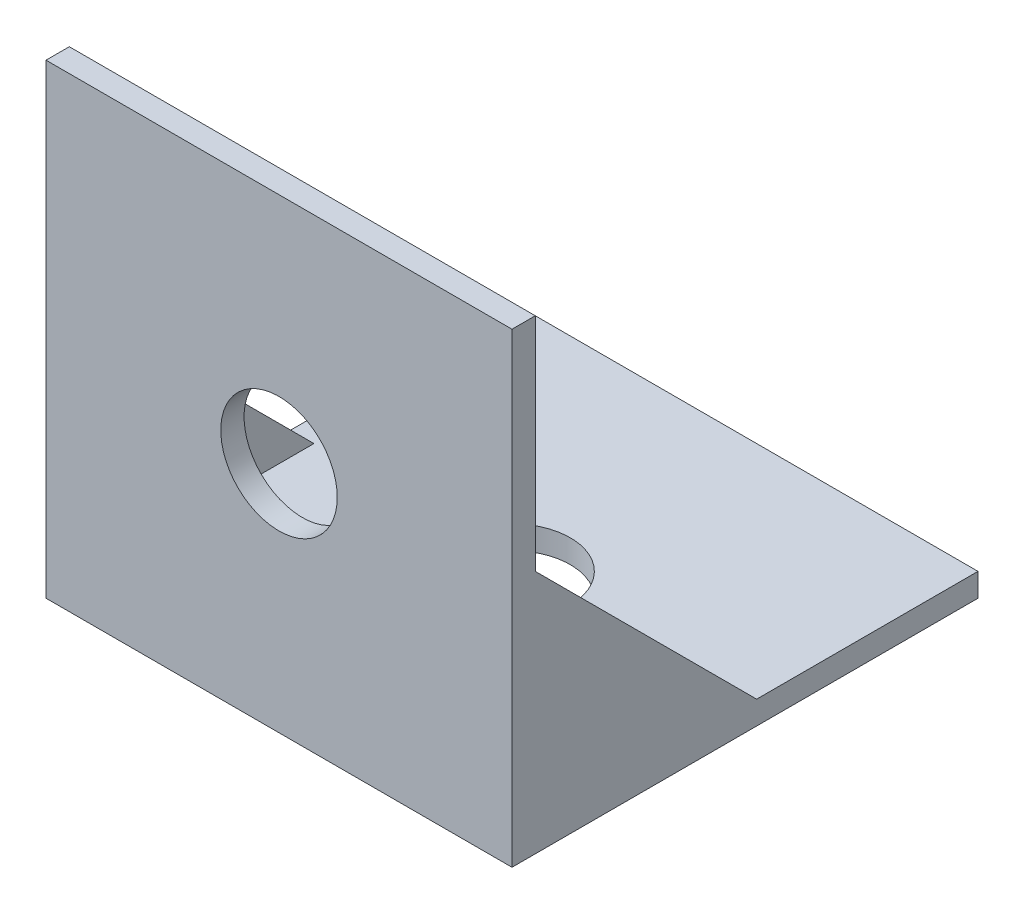
ISO-10303-21;
HEADER;
FILE_DESCRIPTION(('STEP AP214'),'2;1');
FILE_NAME('part.step','',(''),(''),'','','');
FILE_SCHEMA(('AUTOMOTIVE_DESIGN { 1 0 10303 214 1 1 1 1 }'));
ENDSEC;
DATA;
#1=APPLICATION_CONTEXT('core data for automotive mechanical design processes');
#2=APPLICATION_PROTOCOL_DEFINITION('international standard','automotive_design',2000,#1);
#3=PRODUCT_CONTEXT('',#1,'mechanical');
#4=PRODUCT('Part','Part','',(#3));
#5=PRODUCT_RELATED_PRODUCT_CATEGORY('part','',(#4));
#6=PRODUCT_DEFINITION_FORMATION('','',#4);
#7=PRODUCT_DEFINITION_CONTEXT('part definition',#1,'design');
#8=PRODUCT_DEFINITION('design','',#6,#7);
#9=PRODUCT_DEFINITION_SHAPE('','',#8);
#10=(LENGTH_UNIT() NAMED_UNIT(*) SI_UNIT(.MILLI.,.METRE.));
#11=(NAMED_UNIT(*) PLANE_ANGLE_UNIT() SI_UNIT($,.RADIAN.));
#12=(NAMED_UNIT(*) SI_UNIT($,.STERADIAN.) SOLID_ANGLE_UNIT());
#13=UNCERTAINTY_MEASURE_WITH_UNIT(LENGTH_MEASURE(1.E-05),#10,'distance_accuracy_value','');
#14=(GEOMETRIC_REPRESENTATION_CONTEXT(3) GLOBAL_UNCERTAINTY_ASSIGNED_CONTEXT((#13)) GLOBAL_UNIT_ASSIGNED_CONTEXT((#10,
#11,#12)) REPRESENTATION_CONTEXT('',''));
#15=CARTESIAN_POINT('',(0.,0.,0.));
#16=DIRECTION('',(0.,0.,1.));
#17=DIRECTION('',(1.,0.,0.));
#18=AXIS2_PLACEMENT_3D('',#15,#16,#17);
#19=CARTESIAN_POINT('',(0.,1.,0.));
#20=DIRECTION('',(0.,-1.,0.));
#21=DIRECTION('',(0.,0.,-1.));
#22=AXIS2_PLACEMENT_3D('',#19,#20,#21);
#23=PLANE('',#22);
#24=DIRECTION('',(0.,0.,1.));
#25=VECTOR('',#24,1.);
#26=CARTESIAN_POINT('',(-10.,1.,-10.));
#27=LINE('',#26,#25);
#28=CARTESIAN_POINT('',(-10.,1.,-10.));
#29=VERTEX_POINT('',#28);
#30=CARTESIAN_POINT('',(-10.,1.,-0.499999999999999));
#31=VERTEX_POINT('',#30);
#32=EDGE_CURVE('E53',#29,#31,#27,.T.);
#33=ORIENTED_EDGE('',*,*,#32,.T.);
#34=DIRECTION('',(1.,0.,0.));
#35=VECTOR('',#34,1.);
#36=CARTESIAN_POINT('',(-9.99999999999999,1.,-0.499999999999998));
#37=LINE('',#36,#35);
#38=CARTESIAN_POINT('',(-9.,1.,-0.499999999999998));
#39=VERTEX_POINT('',#38);
#40=EDGE_CURVE('E48',#31,#39,#37,.T.);
#41=ORIENTED_EDGE('',*,*,#40,.T.);
#42=DIRECTION('',(0.,0.,-1.));
#43=VECTOR('',#42,1.);
#44=CARTESIAN_POINT('',(-9.,1.,-0.499999999999998));
#45=LINE('',#44,#43);
#46=CARTESIAN_POINT('',(-9.,1.,9.));
#47=VERTEX_POINT('',#46);
#48=EDGE_CURVE('E121',#47,#39,#45,.T.);
#49=ORIENTED_EDGE('',*,*,#48,.F.);
#50=DIRECTION('',(1.,0.,0.));
#51=VECTOR('',#50,1.);
#52=CARTESIAN_POINT('',(0.,1.,9.));
#53=LINE('',#52,#51);
#54=CARTESIAN_POINT('',(9.00000000000001,1.,9.));
#55=VERTEX_POINT('',#54);
#56=EDGE_CURVE('E108',#47,#55,#53,.T.);
#57=ORIENTED_EDGE('',*,*,#56,.T.);
#58=DIRECTION('',(0.,0.,-1.));
#59=VECTOR('',#58,1.);
#60=CARTESIAN_POINT('',(9.00000000000001,1.,-0.499999999999999));
#61=LINE('',#60,#59);
#62=CARTESIAN_POINT('',(9.00000000000001,1.,-0.499999999999999));
#63=VERTEX_POINT('',#62);
#64=EDGE_CURVE('E139',#55,#63,#61,.T.);
#65=ORIENTED_EDGE('',*,*,#64,.T.);
#66=DIRECTION('',(1.,0.,0.));
#67=VECTOR('',#66,1.);
#68=CARTESIAN_POINT('',(9.00000000000001,1.,-0.499999999999999));
#69=LINE('',#68,#67);
#70=CARTESIAN_POINT('',(10.,1.,-0.5));
#71=VERTEX_POINT('',#70);
#72=EDGE_CURVE('E144',#63,#71,#69,.T.);
#73=ORIENTED_EDGE('',*,*,#72,.T.);
#74=DIRECTION('',(0.,0.,-1.));
#75=VECTOR('',#74,1.);
#76=CARTESIAN_POINT('',(10.,1.,-10.));
#77=LINE('',#76,#75);
#78=CARTESIAN_POINT('',(10.,1.,-10.));
#79=VERTEX_POINT('',#78);
#80=EDGE_CURVE('E180',#71,#79,#77,.T.);
#81=ORIENTED_EDGE('',*,*,#80,.T.);
#82=DIRECTION('',(-1.,0.,0.));
#83=VECTOR('',#82,1.);
#84=CARTESIAN_POINT('',(10.,1.,-10.));
#85=LINE('',#84,#83);
#86=EDGE_CURVE('E183',#79,#29,#85,.T.);
#87=ORIENTED_EDGE('',*,*,#86,.T.);
#88=EDGE_LOOP('',(#33,#41,#49,#57,#65,#73,#81,#87));
#89=FACE_BOUND('',#88,.T.);
#90=CARTESIAN_POINT('',(0.,1.,0.));
#91=DIRECTION('',(0.,1.,0.));
#92=DIRECTION('',(0.,0.,1.));
#93=AXIS2_PLACEMENT_3D('',#90,#91,#92);
#94=CIRCLE('',#93,2.5);
#95=CARTESIAN_POINT('',(0.,1.,2.5));
#96=VERTEX_POINT('',#95);
#97=EDGE_CURVE('E173',#96,#96,#94,.T.);
#98=ORIENTED_EDGE('',*,*,#97,.F.);
#99=EDGE_LOOP('',(#98));
#100=FACE_BOUND('',#99,.T.);
#101=ADVANCED_FACE('F33',(#89,#100),#23,.F.);
#102=CARTESIAN_POINT('',(0.,0.,0.));
#103=DIRECTION('',(0.,-1.,0.));
#104=DIRECTION('',(0.,0.,-1.));
#105=AXIS2_PLACEMENT_3D('',#102,#103,#104);
#106=PLANE('',#105);
#107=DIRECTION('',(-1.,0.,0.));
#108=VECTOR('',#107,1.);
#109=CARTESIAN_POINT('',(10.,0.,-10.));
#110=LINE('',#109,#108);
#111=CARTESIAN_POINT('',(10.,0.,-10.));
#112=VERTEX_POINT('',#111);
#113=CARTESIAN_POINT('',(-10.,0.,-10.));
#114=VERTEX_POINT('',#113);
#115=EDGE_CURVE('E181',#112,#114,#110,.T.);
#116=ORIENTED_EDGE('',*,*,#115,.F.);
#117=DIRECTION('',(0.,0.,-1.));
#118=VECTOR('',#117,1.);
#119=CARTESIAN_POINT('',(10.,0.,-10.));
#120=LINE('',#119,#118);
#121=CARTESIAN_POINT('',(10.,0.,10.));
#122=VERTEX_POINT('',#121);
#123=EDGE_CURVE('E189',#122,#112,#120,.T.);
#124=ORIENTED_EDGE('',*,*,#123,.F.);
#125=DIRECTION('',(1.,0.,0.));
#126=VECTOR('',#125,1.);
#127=CARTESIAN_POINT('',(10.,0.,10.));
#128=LINE('',#127,#126);
#129=CARTESIAN_POINT('',(-9.99999999999999,0.,10.));
#130=VERTEX_POINT('',#129);
#131=EDGE_CURVE('E187',#130,#122,#128,.T.);
#132=ORIENTED_EDGE('',*,*,#131,.F.);
#133=DIRECTION('',(0.,0.,1.));
#134=VECTOR('',#133,1.);
#135=CARTESIAN_POINT('',(-10.,0.,-10.));
#136=LINE('',#135,#134);
#137=EDGE_CURVE('E176',#114,#130,#136,.T.);
#138=ORIENTED_EDGE('',*,*,#137,.F.);
#139=EDGE_LOOP('',(#116,#124,#132,#138));
#140=FACE_BOUND('',#139,.T.);
#141=CARTESIAN_POINT('',(0.,0.,0.));
#142=DIRECTION('',(0.,1.,0.));
#143=DIRECTION('',(0.,0.,1.));
#144=AXIS2_PLACEMENT_3D('',#141,#142,#143);
#145=CIRCLE('',#144,2.5);
#146=CARTESIAN_POINT('',(0.,0.,2.5));
#147=VERTEX_POINT('',#146);
#148=EDGE_CURVE('E118',#147,#147,#145,.T.);
#149=ORIENTED_EDGE('',*,*,#148,.T.);
#150=EDGE_LOOP('',(#149));
#151=FACE_BOUND('',#150,.T.);
#152=ADVANCED_FACE('F208',(#140,#151),#106,.T.);
#153=CARTESIAN_POINT('',(-10.,1.,-10.));
#154=DIRECTION('',(1.,0.,0.));
#155=DIRECTION('',(0.,0.,-1.));
#156=AXIS2_PLACEMENT_3D('',#153,#154,#155);
#157=PLANE('',#156);
#158=DIRECTION('',(0.,0.707106781186547,0.707106781186548));
#159=VECTOR('',#158,1.);
#160=CARTESIAN_POINT('',(-9.99999999999999,10.5,9.));
#161=LINE('',#160,#159);
#162=CARTESIAN_POINT('',(-9.99999999999999,10.5,9.));
#163=VERTEX_POINT('',#162);
#164=EDGE_CURVE('E131',#31,#163,#161,.T.);
#165=ORIENTED_EDGE('',*,*,#164,.F.);
#166=ORIENTED_EDGE('',*,*,#32,.F.);
#167=DIRECTION('',(0.,-1.,0.));
#168=VECTOR('',#167,1.);
#169=CARTESIAN_POINT('',(-10.,1.,-10.));
#170=LINE('',#169,#168);
#171=EDGE_CURVE('E185',#29,#114,#170,.T.);
#172=ORIENTED_EDGE('',*,*,#171,.T.);
#173=ORIENTED_EDGE('',*,*,#137,.T.);
#174=DIRECTION('',(0.,-1.,0.));
#175=VECTOR('',#174,1.);
#176=CARTESIAN_POINT('',(-9.99999999999999,1.,10.));
#177=LINE('',#176,#175);
#178=CARTESIAN_POINT('',(-9.99999999999999,20.,10.));
#179=VERTEX_POINT('',#178);
#180=EDGE_CURVE('E11',#179,#130,#177,.T.);
#181=ORIENTED_EDGE('',*,*,#180,.F.);
#182=DIRECTION('',(0.,0.,1.));
#183=VECTOR('',#182,1.);
#184=CARTESIAN_POINT('',(-9.99999999999999,20.,9.));
#185=LINE('',#184,#183);
#186=CARTESIAN_POINT('',(-9.99999999999999,20.,9.));
#187=VERTEX_POINT('',#186);
#188=EDGE_CURVE('E119',#187,#179,#185,.T.);
#189=ORIENTED_EDGE('',*,*,#188,.F.);
#190=DIRECTION('',(0.,-1.,0.));
#191=VECTOR('',#190,1.);
#192=CARTESIAN_POINT('',(-9.99999999999999,0.,9.));
#193=LINE('',#192,#191);
#194=EDGE_CURVE('E158',#187,#163,#193,.T.);
#195=ORIENTED_EDGE('',*,*,#194,.T.);
#196=EDGE_LOOP('',(#165,#166,#172,#173,#181,#189,#195));
#197=FACE_BOUND('',#196,.T.);
#198=ADVANCED_FACE('F35',(#197),#157,.F.);
#199=CARTESIAN_POINT('',(10.,1.,10.));
#200=DIRECTION('',(0.,0.,-1.));
#201=DIRECTION('',(-1.,0.,0.));
#202=AXIS2_PLACEMENT_3D('',#199,#200,#201);
#203=PLANE('',#202);
#204=ORIENTED_EDGE('',*,*,#131,.T.);
#205=DIRECTION('',(0.,-1.,0.));
#206=VECTOR('',#205,1.);
#207=CARTESIAN_POINT('',(10.,1.,10.));
#208=LINE('',#207,#206);
#209=CARTESIAN_POINT('',(10.,20.,10.));
#210=VERTEX_POINT('',#209);
#211=EDGE_CURVE('E41',#210,#122,#208,.T.);
#212=ORIENTED_EDGE('',*,*,#211,.F.);
#213=DIRECTION('',(-1.,0.,0.));
#214=VECTOR('',#213,1.);
#215=CARTESIAN_POINT('',(-9.99999999999999,20.,10.));
#216=LINE('',#215,#214);
#217=EDGE_CURVE('E155',#210,#179,#216,.T.);
#218=ORIENTED_EDGE('',*,*,#217,.T.);
#219=ORIENTED_EDGE('',*,*,#180,.T.);
#220=EDGE_LOOP('',(#204,#212,#218,#219));
#221=FACE_BOUND('',#220,.T.);
#222=CARTESIAN_POINT('',(0.,10.,10.));
#223=DIRECTION('',(0.,0.,1.));
#224=DIRECTION('',(1.,0.,0.));
#225=AXIS2_PLACEMENT_3D('',#222,#223,#224);
#226=CIRCLE('',#225,2.5);
#227=CARTESIAN_POINT('',(2.5,10.,10.));
#228=VERTEX_POINT('',#227);
#229=EDGE_CURVE('E149',#228,#228,#226,.T.);
#230=ORIENTED_EDGE('',*,*,#229,.F.);
#231=EDGE_LOOP('',(#230));
#232=FACE_BOUND('',#231,.T.);
#233=ADVANCED_FACE('F225',(#221,#232),#203,.F.);
#234=CARTESIAN_POINT('',(10.,1.,-10.));
#235=DIRECTION('',(-1.,0.,0.));
#236=DIRECTION('',(0.,0.,1.));
#237=AXIS2_PLACEMENT_3D('',#234,#235,#236);
#238=PLANE('',#237);
#239=ORIENTED_EDGE('',*,*,#80,.F.);
#240=DIRECTION('',(0.,0.707106781186547,0.707106781186548));
#241=VECTOR('',#240,1.);
#242=CARTESIAN_POINT('',(10.,10.5,9.));
#243=LINE('',#242,#241);
#244=CARTESIAN_POINT('',(10.,10.5,9.));
#245=VERTEX_POINT('',#244);
#246=EDGE_CURVE('E136',#71,#245,#243,.T.);
#247=ORIENTED_EDGE('',*,*,#246,.T.);
#248=DIRECTION('',(0.,1.,0.));
#249=VECTOR('',#248,1.);
#250=CARTESIAN_POINT('',(10.,0.,9.));
#251=LINE('',#250,#249);
#252=CARTESIAN_POINT('',(10.,20.,9.));
#253=VERTEX_POINT('',#252);
#254=EDGE_CURVE('E161',#245,#253,#251,.T.);
#255=ORIENTED_EDGE('',*,*,#254,.T.);
#256=DIRECTION('',(0.,0.,1.));
#257=VECTOR('',#256,1.);
#258=CARTESIAN_POINT('',(10.,20.,9.));
#259=LINE('',#258,#257);
#260=EDGE_CURVE('E166',#253,#210,#259,.T.);
#261=ORIENTED_EDGE('',*,*,#260,.T.);
#262=ORIENTED_EDGE('',*,*,#211,.T.);
#263=ORIENTED_EDGE('',*,*,#123,.T.);
#264=DIRECTION('',(0.,-1.,0.));
#265=VECTOR('',#264,1.);
#266=CARTESIAN_POINT('',(10.,1.,-10.));
#267=LINE('',#266,#265);
#268=EDGE_CURVE('E194',#79,#112,#267,.T.);
#269=ORIENTED_EDGE('',*,*,#268,.F.);
#270=EDGE_LOOP('',(#239,#247,#255,#261,#262,#263,#269));
#271=FACE_BOUND('',#270,.T.);
#272=ADVANCED_FACE('F200',(#271),#238,.F.);
#273=CARTESIAN_POINT('',(10.,1.,-10.));
#274=DIRECTION('',(0.,0.,1.));
#275=DIRECTION('',(1.,0.,0.));
#276=AXIS2_PLACEMENT_3D('',#273,#274,#275);
#277=PLANE('',#276);
#278=ORIENTED_EDGE('',*,*,#115,.T.);
#279=ORIENTED_EDGE('',*,*,#171,.F.);
#280=ORIENTED_EDGE('',*,*,#86,.F.);
#281=ORIENTED_EDGE('',*,*,#268,.T.);
#282=EDGE_LOOP('',(#278,#279,#280,#281));
#283=FACE_BOUND('',#282,.T.);
#284=ADVANCED_FACE('F213',(#283),#277,.F.);
#285=CARTESIAN_POINT('',(0.,1.,0.));
#286=DIRECTION('',(0.,-1.,0.));
#287=DIRECTION('',(0.,0.,-1.));
#288=AXIS2_PLACEMENT_3D('',#285,#286,#287);
#289=CYLINDRICAL_SURFACE('',#288,2.5);
#290=ORIENTED_EDGE('',*,*,#97,.T.);
#291=EDGE_LOOP('',(#290));
#292=FACE_BOUND('',#291,.T.);
#293=ORIENTED_EDGE('',*,*,#148,.F.);
#294=EDGE_LOOP('',(#293));
#295=FACE_BOUND('',#294,.T.);
#296=ADVANCED_FACE('F252',(#292,#295),#289,.F.);
#297=CARTESIAN_POINT('',(0.,0.,9.));
#298=DIRECTION('',(0.,0.,-1.));
#299=DIRECTION('',(-1.,0.,0.));
#300=AXIS2_PLACEMENT_3D('',#297,#298,#299);
#301=PLANE('',#300);
#302=DIRECTION('',(1.,0.,0.));
#303=VECTOR('',#302,1.);
#304=CARTESIAN_POINT('',(-9.99999999999999,10.5,9.));
#305=LINE('',#304,#303);
#306=CARTESIAN_POINT('',(-9.,10.5,9.));
#307=VERTEX_POINT('',#306);
#308=EDGE_CURVE('E134',#163,#307,#305,.T.);
#309=ORIENTED_EDGE('',*,*,#308,.F.);
#310=ORIENTED_EDGE('',*,*,#194,.F.);
#311=DIRECTION('',(-1.,0.,0.));
#312=VECTOR('',#311,1.);
#313=CARTESIAN_POINT('',(-9.99999999999999,20.,9.));
#314=LINE('',#313,#312);
#315=EDGE_CURVE('E163',#253,#187,#314,.T.);
#316=ORIENTED_EDGE('',*,*,#315,.F.);
#317=ORIENTED_EDGE('',*,*,#254,.F.);
#318=DIRECTION('',(1.,0.,0.));
#319=VECTOR('',#318,1.);
#320=CARTESIAN_POINT('',(9.00000000000001,10.5,9.));
#321=LINE('',#320,#319);
#322=CARTESIAN_POINT('',(9.00000000000001,10.5,9.));
#323=VERTEX_POINT('',#322);
#324=EDGE_CURVE('E146',#323,#245,#321,.T.);
#325=ORIENTED_EDGE('',*,*,#324,.F.);
#326=DIRECTION('',(0.,-1.,0.));
#327=VECTOR('',#326,1.);
#328=CARTESIAN_POINT('',(9.00000000000001,1.,9.));
#329=LINE('',#328,#327);
#330=EDGE_CURVE('E115',#323,#55,#329,.T.);
#331=ORIENTED_EDGE('',*,*,#330,.T.);
#332=ORIENTED_EDGE('',*,*,#56,.F.);
#333=DIRECTION('',(0.,-1.,0.));
#334=VECTOR('',#333,1.);
#335=CARTESIAN_POINT('',(-9.,1.,9.));
#336=LINE('',#335,#334);
#337=EDGE_CURVE('E112',#307,#47,#336,.T.);
#338=ORIENTED_EDGE('',*,*,#337,.F.);
#339=EDGE_LOOP('',(#309,#310,#316,#317,#325,#331,#332,#338));
#340=FACE_BOUND('',#339,.T.);
#341=CARTESIAN_POINT('',(0.,10.,9.));
#342=DIRECTION('',(0.,0.,1.));
#343=DIRECTION('',(1.,0.,0.));
#344=AXIS2_PLACEMENT_3D('',#341,#342,#343);
#345=CIRCLE('',#344,2.5);
#346=CARTESIAN_POINT('',(2.5,10.,9.));
#347=VERTEX_POINT('',#346);
#348=EDGE_CURVE('E152',#347,#347,#345,.T.);
#349=ORIENTED_EDGE('',*,*,#348,.T.);
#350=EDGE_LOOP('',(#349));
#351=FACE_BOUND('',#350,.T.);
#352=ADVANCED_FACE('F109',(#340,#351),#301,.T.);
#353=CARTESIAN_POINT('',(-9.99999999999999,20.,9.));
#354=DIRECTION('',(0.,1.,0.));
#355=DIRECTION('',(0.,0.,1.));
#356=AXIS2_PLACEMENT_3D('',#353,#354,#355);
#357=PLANE('',#356);
#358=ORIENTED_EDGE('',*,*,#217,.F.);
#359=ORIENTED_EDGE('',*,*,#260,.F.);
#360=ORIENTED_EDGE('',*,*,#315,.T.);
#361=ORIENTED_EDGE('',*,*,#188,.T.);
#362=EDGE_LOOP('',(#358,#359,#360,#361));
#363=FACE_BOUND('',#362,.T.);
#364=ADVANCED_FACE('F224',(#363),#357,.T.);
#365=CARTESIAN_POINT('',(0.,10.,9.));
#366=DIRECTION('',(0.,0.,1.));
#367=DIRECTION('',(1.,0.,0.));
#368=AXIS2_PLACEMENT_3D('',#365,#366,#367);
#369=CYLINDRICAL_SURFACE('',#368,2.5);
#370=ORIENTED_EDGE('',*,*,#348,.F.);
#371=EDGE_LOOP('',(#370));
#372=FACE_BOUND('',#371,.T.);
#373=ORIENTED_EDGE('',*,*,#229,.T.);
#374=EDGE_LOOP('',(#373));
#375=FACE_BOUND('',#374,.T.);
#376=ADVANCED_FACE('F230',(#372,#375),#369,.F.);
#377=CARTESIAN_POINT('',(9.00000000000001,10.5,9.));
#378=DIRECTION('',(0.,0.707106781186548,-0.707106781186547));
#379=DIRECTION('',(0.,0.707106781186547,0.707106781186548));
#380=AXIS2_PLACEMENT_3D('',#377,#378,#379);
#381=PLANE('',#380);
#382=ORIENTED_EDGE('',*,*,#246,.F.);
#383=ORIENTED_EDGE('',*,*,#72,.F.);
#384=DIRECTION('',(0.,0.707106781186547,0.707106781186548));
#385=VECTOR('',#384,1.);
#386=CARTESIAN_POINT('',(9.00000000000001,10.5,9.));
#387=LINE('',#386,#385);
#388=EDGE_CURVE('E141',#63,#323,#387,.T.);
#389=ORIENTED_EDGE('',*,*,#388,.T.);
#390=ORIENTED_EDGE('',*,*,#324,.T.);
#391=EDGE_LOOP('',(#382,#383,#389,#390));
#392=FACE_BOUND('',#391,.T.);
#393=ADVANCED_FACE('F232',(#392),#381,.T.);
#394=CARTESIAN_POINT('',(9.00000000000001,0.,0.));
#395=DIRECTION('',(1.,0.,0.));
#396=DIRECTION('',(0.,0.,-1.));
#397=AXIS2_PLACEMENT_3D('',#394,#395,#396);
#398=PLANE('',#397);
#399=ORIENTED_EDGE('',*,*,#330,.F.);
#400=ORIENTED_EDGE('',*,*,#388,.F.);
#401=ORIENTED_EDGE('',*,*,#64,.F.);
#402=EDGE_LOOP('',(#399,#400,#401));
#403=FACE_BOUND('',#402,.T.);
#404=ADVANCED_FACE('F239',(#403),#398,.F.);
#405=CARTESIAN_POINT('',(-9.99999999999999,10.5,9.));
#406=DIRECTION('',(0.,0.707106781186548,-0.707106781186547));
#407=DIRECTION('',(0.,0.707106781186547,0.707106781186548));
#408=AXIS2_PLACEMENT_3D('',#405,#406,#407);
#409=PLANE('',#408);
#410=DIRECTION('',(0.,0.707106781186547,0.707106781186548));
#411=VECTOR('',#410,1.);
#412=CARTESIAN_POINT('',(-9.,10.5,9.));
#413=LINE('',#412,#411);
#414=EDGE_CURVE('E126',#39,#307,#413,.T.);
#415=ORIENTED_EDGE('',*,*,#414,.F.);
#416=ORIENTED_EDGE('',*,*,#40,.F.);
#417=ORIENTED_EDGE('',*,*,#164,.T.);
#418=ORIENTED_EDGE('',*,*,#308,.T.);
#419=EDGE_LOOP('',(#415,#416,#417,#418));
#420=FACE_BOUND('',#419,.T.);
#421=ADVANCED_FACE('F220',(#420),#409,.T.);
#422=CARTESIAN_POINT('',(-9.,0.,0.));
#423=DIRECTION('',(1.,0.,0.));
#424=DIRECTION('',(0.,0.,-1.));
#425=AXIS2_PLACEMENT_3D('',#422,#423,#424);
#426=PLANE('',#425);
#427=ORIENTED_EDGE('',*,*,#337,.T.);
#428=ORIENTED_EDGE('',*,*,#48,.T.);
#429=ORIENTED_EDGE('',*,*,#414,.T.);
#430=EDGE_LOOP('',(#427,#428,#429));
#431=FACE_BOUND('',#430,.T.);
#432=ADVANCED_FACE('F128',(#431),#426,.T.);
#433=CLOSED_SHELL('',(#101,#152,#198,#233,#272,#284,#296,#352,#364,#376,#393,#404,#421,#432));
#434=MANIFOLD_SOLID_BREP('B2',#433);
#435=ADVANCED_BREP_SHAPE_REPRESENTATION('',(#18,#434),#14);
#436=SHAPE_DEFINITION_REPRESENTATION(#9,#435);
ENDSEC;
END-ISO-10303-21;
